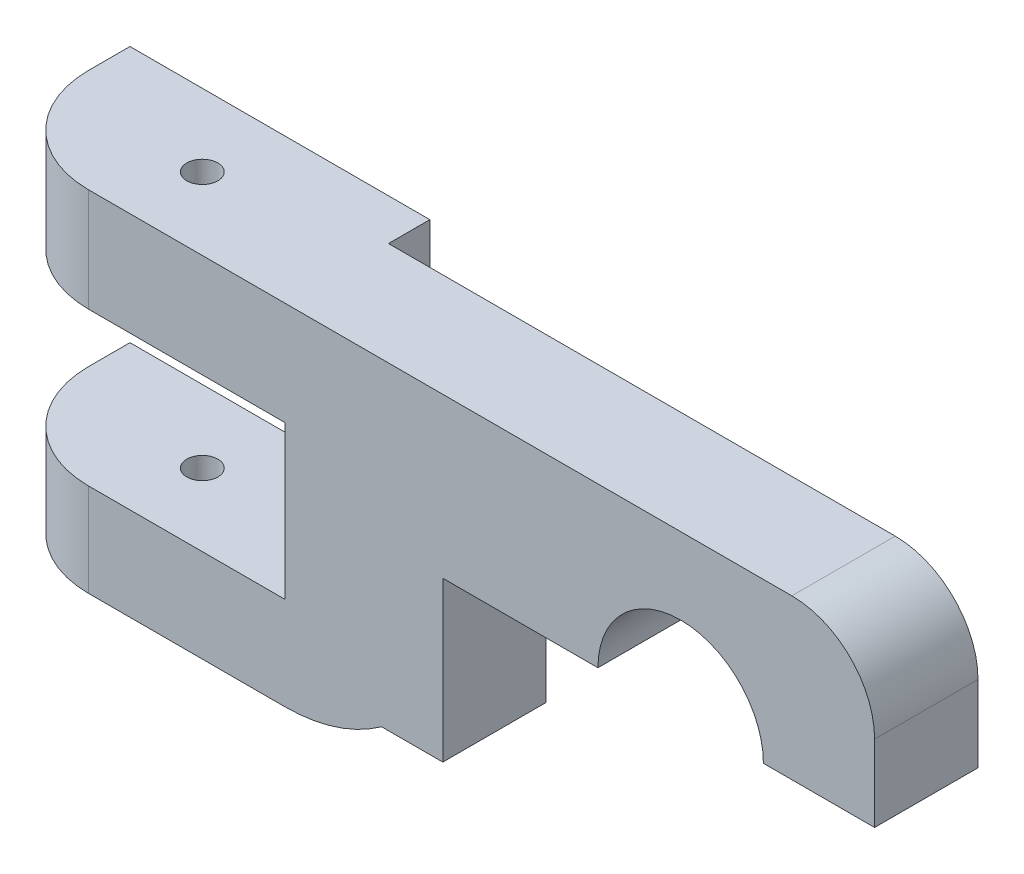
ISO-10303-21;
HEADER;
FILE_DESCRIPTION(('STEP AP214'),'2;1');
FILE_NAME('part.step','',(''),(''),'','','');
FILE_SCHEMA(('AUTOMOTIVE_DESIGN { 1 0 10303 214 1 1 1 1 }'));
ENDSEC;
DATA;
#1=APPLICATION_CONTEXT('core data for automotive mechanical design processes');
#2=APPLICATION_PROTOCOL_DEFINITION('international standard','automotive_design',2000,#1);
#3=PRODUCT_CONTEXT('',#1,'mechanical');
#4=PRODUCT('Part','Part','',(#3));
#5=PRODUCT_RELATED_PRODUCT_CATEGORY('part','',(#4));
#6=PRODUCT_DEFINITION_FORMATION('','',#4);
#7=PRODUCT_DEFINITION_CONTEXT('part definition',#1,'design');
#8=PRODUCT_DEFINITION('design','',#6,#7);
#9=PRODUCT_DEFINITION_SHAPE('','',#8);
#10=(LENGTH_UNIT() NAMED_UNIT(*) SI_UNIT(.MILLI.,.METRE.));
#11=(NAMED_UNIT(*) PLANE_ANGLE_UNIT() SI_UNIT($,.RADIAN.));
#12=(NAMED_UNIT(*) SI_UNIT($,.STERADIAN.) SOLID_ANGLE_UNIT());
#13=UNCERTAINTY_MEASURE_WITH_UNIT(LENGTH_MEASURE(1.E-05),#10,'distance_accuracy_value','');
#14=(GEOMETRIC_REPRESENTATION_CONTEXT(3) GLOBAL_UNCERTAINTY_ASSIGNED_CONTEXT((#13)) GLOBAL_UNIT_ASSIGNED_CONTEXT((#10,
#11,#12)) REPRESENTATION_CONTEXT('',''));
#15=CARTESIAN_POINT('',(0.,0.,0.));
#16=DIRECTION('',(0.,0.,1.));
#17=DIRECTION('',(1.,0.,0.));
#18=AXIS2_PLACEMENT_3D('',#15,#16,#17);
#19=CARTESIAN_POINT('',(0.,-33.8,96.5));
#20=DIRECTION('',(0.,1.,0.));
#21=DIRECTION('',(0.,0.,1.));
#22=AXIS2_PLACEMENT_3D('',#19,#20,#21);
#23=PLANE('',#22);
#24=CARTESIAN_POINT('',(14.,-33.8,89.5));
#25=DIRECTION('',(0.,1.,0.));
#26=DIRECTION('',(0.,0.,1.));
#27=AXIS2_PLACEMENT_3D('',#24,#25,#26);
#28=CIRCLE('',#27,1.5);
#29=CARTESIAN_POINT('',(14.,-33.8,91.));
#30=VERTEX_POINT('',#29);
#31=EDGE_CURVE('E230',#30,#30,#28,.T.);
#32=ORIENTED_EDGE('',*,*,#31,.T.);
#33=EDGE_LOOP('',(#32));
#34=FACE_BOUND('',#33,.T.);
#35=DIRECTION('',(0.,0.,-1.));
#36=VECTOR('',#35,1.);
#37=CARTESIAN_POINT('',(0.,-33.8,96.5));
#38=LINE('',#37,#36);
#39=CARTESIAN_POINT('',(0.,-33.8,86.5));
#40=VERTEX_POINT('',#39);
#41=CARTESIAN_POINT('',(0.,-33.8,82.5));
#42=VERTEX_POINT('',#41);
#43=EDGE_CURVE('E232',#40,#42,#38,.T.);
#44=ORIENTED_EDGE('',*,*,#43,.T.);
#45=DIRECTION('',(1.,0.,0.));
#46=VECTOR('',#45,1.);
#47=CARTESIAN_POINT('',(29.,-33.8,82.5));
#48=LINE('',#47,#46);
#49=CARTESIAN_POINT('',(29.,-33.8,82.5));
#50=VERTEX_POINT('',#49);
#51=EDGE_CURVE('E259',#42,#50,#48,.T.);
#52=ORIENTED_EDGE('',*,*,#51,.T.);
#53=DIRECTION('',(0.,0.,-1.));
#54=VECTOR('',#53,1.);
#55=CARTESIAN_POINT('',(29.,-33.8,96.5));
#56=LINE('',#55,#54);
#57=CARTESIAN_POINT('',(29.,-33.8,86.5));
#58=VERTEX_POINT('',#57);
#59=EDGE_CURVE('E261',#50,#58,#56,.F.);
#60=ORIENTED_EDGE('',*,*,#59,.T.);
#61=DIRECTION('',(0.,0.,-1.));
#62=VECTOR('',#61,1.);
#63=CARTESIAN_POINT('',(29.,-33.8,96.5));
#64=LINE('',#63,#62);
#65=CARTESIAN_POINT('',(29.,-33.8,96.5));
#66=VERTEX_POINT('',#65);
#67=EDGE_CURVE('E207',#66,#58,#64,.T.);
#68=ORIENTED_EDGE('',*,*,#67,.F.);
#69=DIRECTION('',(1.,0.,0.));
#70=VECTOR('',#69,1.);
#71=CARTESIAN_POINT('',(0.,-33.8,96.5));
#72=LINE('',#71,#70);
#73=CARTESIAN_POINT('',(10.,-33.8,96.5));
#74=VERTEX_POINT('',#73);
#75=EDGE_CURVE('E201',#74,#66,#72,.T.);
#76=ORIENTED_EDGE('',*,*,#75,.F.);
#77=CARTESIAN_POINT('',(10.,-33.8,86.5));
#78=DIRECTION('',(0.,1.,0.));
#79=DIRECTION('',(0.,0.,1.));
#80=AXIS2_PLACEMENT_3D('',#77,#78,#79);
#81=CIRCLE('',#80,10.);
#82=EDGE_CURVE('E291',#74,#40,#81,.F.);
#83=ORIENTED_EDGE('',*,*,#82,.T.);
#84=EDGE_LOOP('',(#44,#52,#60,#68,#76,#83));
#85=FACE_BOUND('',#84,.T.);
#86=ADVANCED_FACE('F36',(#34,#85),#23,.F.);
#87=CARTESIAN_POINT('',(0.,0.,96.5));
#88=DIRECTION('',(1.,0.,0.));
#89=DIRECTION('',(0.,1.,0.));
#90=AXIS2_PLACEMENT_3D('',#87,#88,#89);
#91=PLANE('',#90);
#92=DIRECTION('',(0.,0.,-1.));
#93=VECTOR('',#92,1.);
#94=CARTESIAN_POINT('',(0.,-24.8,96.5));
#95=LINE('',#94,#93);
#96=CARTESIAN_POINT('',(0.,-24.8,86.5));
#97=VERTEX_POINT('',#96);
#98=CARTESIAN_POINT('',(0.,-24.8,82.5));
#99=VERTEX_POINT('',#98);
#100=EDGE_CURVE('E287',#97,#99,#95,.T.);
#101=ORIENTED_EDGE('',*,*,#100,.T.);
#102=DIRECTION('',(0.,1.,0.));
#103=VECTOR('',#102,1.);
#104=CARTESIAN_POINT('',(0.,-33.8,82.5));
#105=LINE('',#104,#103);
#106=EDGE_CURVE('E11',#42,#99,#105,.T.);
#107=ORIENTED_EDGE('',*,*,#106,.F.);
#108=ORIENTED_EDGE('',*,*,#43,.F.);
#109=DIRECTION('',(0.,-1.,0.));
#110=VECTOR('',#109,1.);
#111=CARTESIAN_POINT('',(0.,-24.8,86.5));
#112=LINE('',#111,#110);
#113=EDGE_CURVE('E290',#40,#97,#112,.F.);
#114=ORIENTED_EDGE('',*,*,#113,.T.);
#115=EDGE_LOOP('',(#101,#107,#108,#114));
#116=FACE_BOUND('',#115,.T.);
#117=ADVANCED_FACE('F376',(#116),#91,.F.);
#118=CARTESIAN_POINT('',(0.,-24.8,96.5));
#119=DIRECTION('',(0.,1.,0.));
#120=DIRECTION('',(0.,0.,1.));
#121=AXIS2_PLACEMENT_3D('',#118,#119,#120);
#122=PLANE('',#121);
#123=DIRECTION('',(1.,0.,0.));
#124=VECTOR('',#123,1.);
#125=CARTESIAN_POINT('',(0.,-24.8,82.5));
#126=LINE('',#125,#124);
#127=CARTESIAN_POINT('',(29.,-24.8,82.5));
#128=VERTEX_POINT('',#127);
#129=EDGE_CURVE('E46',#99,#128,#126,.T.);
#130=ORIENTED_EDGE('',*,*,#129,.F.);
#131=ORIENTED_EDGE('',*,*,#100,.F.);
#132=CARTESIAN_POINT('',(10.,-24.8,86.5));
#133=DIRECTION('',(0.,1.,0.));
#134=DIRECTION('',(0.,0.,1.));
#135=AXIS2_PLACEMENT_3D('',#132,#133,#134);
#136=CIRCLE('',#135,10.);
#137=CARTESIAN_POINT('',(10.,-24.8,96.5));
#138=VERTEX_POINT('',#137);
#139=EDGE_CURVE('E327',#97,#138,#136,.T.);
#140=ORIENTED_EDGE('',*,*,#139,.T.);
#141=DIRECTION('',(1.,0.,0.));
#142=VECTOR('',#141,1.);
#143=CARTESIAN_POINT('',(0.,-24.8,96.5));
#144=LINE('',#143,#142);
#145=CARTESIAN_POINT('',(29.,-24.8,96.5));
#146=VERTEX_POINT('',#145);
#147=EDGE_CURVE('E286',#138,#146,#144,.T.);
#148=ORIENTED_EDGE('',*,*,#147,.T.);
#149=DIRECTION('',(0.,0.,-1.));
#150=VECTOR('',#149,1.);
#151=CARTESIAN_POINT('',(29.,-24.8,96.5));
#152=LINE('',#151,#150);
#153=CARTESIAN_POINT('',(29.,-24.8,86.5));
#154=VERTEX_POINT('',#153);
#155=EDGE_CURVE('E282',#146,#154,#152,.T.);
#156=ORIENTED_EDGE('',*,*,#155,.T.);
#157=DIRECTION('',(0.,0.,1.));
#158=VECTOR('',#157,1.);
#159=CARTESIAN_POINT('',(29.,-24.8,96.5));
#160=LINE('',#159,#158);
#161=EDGE_CURVE('E255',#128,#154,#160,.T.);
#162=ORIENTED_EDGE('',*,*,#161,.F.);
#163=EDGE_LOOP('',(#130,#131,#140,#148,#156,#162));
#164=FACE_BOUND('',#163,.T.);
#165=CARTESIAN_POINT('',(14.,-24.8,89.5));
#166=DIRECTION('',(0.,1.,0.));
#167=DIRECTION('',(0.,0.,1.));
#168=AXIS2_PLACEMENT_3D('',#165,#166,#167);
#169=CIRCLE('',#168,1.5);
#170=CARTESIAN_POINT('',(14.,-24.8,91.));
#171=VERTEX_POINT('',#170);
#172=EDGE_CURVE('E221',#171,#171,#169,.T.);
#173=ORIENTED_EDGE('',*,*,#172,.F.);
#174=EDGE_LOOP('',(#173));
#175=FACE_BOUND('',#174,.T.);
#176=ADVANCED_FACE('F382',(#164,#175),#122,.T.);
#177=CARTESIAN_POINT('',(29.,-10.,96.5));
#178=DIRECTION('',(0.,-1.,0.));
#179=DIRECTION('',(1.,0.,0.));
#180=AXIS2_PLACEMENT_3D('',#177,#178,#179);
#181=PLANE('',#180);
#182=DIRECTION('',(-1.,0.,0.));
#183=VECTOR('',#182,1.);
#184=CARTESIAN_POINT('',(29.,-10.,82.5));
#185=LINE('',#184,#183);
#186=CARTESIAN_POINT('',(29.,-9.99999999999999,82.5));
#187=VERTEX_POINT('',#186);
#188=CARTESIAN_POINT('',(0.,-10.,82.5));
#189=VERTEX_POINT('',#188);
#190=EDGE_CURVE('E243',#187,#189,#185,.T.);
#191=ORIENTED_EDGE('',*,*,#190,.F.);
#192=DIRECTION('',(0.,0.,-1.));
#193=VECTOR('',#192,1.);
#194=CARTESIAN_POINT('',(29.,-10.,96.5));
#195=LINE('',#194,#193);
#196=CARTESIAN_POINT('',(29.,-10.,86.5));
#197=VERTEX_POINT('',#196);
#198=EDGE_CURVE('E293',#197,#187,#195,.T.);
#199=ORIENTED_EDGE('',*,*,#198,.F.);
#200=DIRECTION('',(0.,0.,-1.));
#201=VECTOR('',#200,1.);
#202=CARTESIAN_POINT('',(29.,-10.,96.5));
#203=LINE('',#202,#201);
#204=CARTESIAN_POINT('',(29.,-10.,96.5));
#205=VERTEX_POINT('',#204);
#206=EDGE_CURVE('E217',#205,#197,#203,.T.);
#207=ORIENTED_EDGE('',*,*,#206,.F.);
#208=DIRECTION('',(-1.,0.,0.));
#209=VECTOR('',#208,1.);
#210=CARTESIAN_POINT('',(29.,-10.,96.5));
#211=LINE('',#210,#209);
#212=CARTESIAN_POINT('',(10.,-10.,96.5));
#213=VERTEX_POINT('',#212);
#214=EDGE_CURVE('E285',#205,#213,#211,.T.);
#215=ORIENTED_EDGE('',*,*,#214,.T.);
#216=CARTESIAN_POINT('',(10.,-10.,86.5));
#217=DIRECTION('',(0.,-1.,0.));
#218=DIRECTION('',(1.,0.,0.));
#219=AXIS2_PLACEMENT_3D('',#216,#217,#218);
#220=CIRCLE('',#219,10.);
#221=CARTESIAN_POINT('',(0.,-10.,86.5));
#222=VERTEX_POINT('',#221);
#223=EDGE_CURVE('E278',#213,#222,#220,.T.);
#224=ORIENTED_EDGE('',*,*,#223,.T.);
#225=DIRECTION('',(0.,0.,-1.));
#226=VECTOR('',#225,1.);
#227=CARTESIAN_POINT('',(0.,-10.,96.5));
#228=LINE('',#227,#226);
#229=EDGE_CURVE('E275',#222,#189,#228,.T.);
#230=ORIENTED_EDGE('',*,*,#229,.T.);
#231=EDGE_LOOP('',(#191,#199,#207,#215,#224,#230));
#232=FACE_BOUND('',#231,.T.);
#233=CARTESIAN_POINT('',(14.,-10.,89.5));
#234=DIRECTION('',(0.,-1.,0.));
#235=DIRECTION('',(1.,0.,0.));
#236=AXIS2_PLACEMENT_3D('',#233,#234,#235);
#237=CIRCLE('',#236,1.5);
#238=CARTESIAN_POINT('',(15.5,-10.,89.5));
#239=VERTEX_POINT('',#238);
#240=EDGE_CURVE('E225',#239,#239,#237,.T.);
#241=ORIENTED_EDGE('',*,*,#240,.F.);
#242=EDGE_LOOP('',(#241));
#243=FACE_BOUND('',#242,.T.);
#244=ADVANCED_FACE('F38',(#232,#243),#181,.T.);
#245=CARTESIAN_POINT('',(0.,-10.,96.5));
#246=DIRECTION('',(-1.,0.,0.));
#247=DIRECTION('',(0.,0.,1.));
#248=AXIS2_PLACEMENT_3D('',#245,#246,#247);
#249=PLANE('',#248);
#250=CARTESIAN_POINT('',(0.,0.,82.5));
#251=VERTEX_POINT('',#250);
#252=EDGE_CURVE('E48',#189,#251,#105,.T.);
#253=ORIENTED_EDGE('',*,*,#252,.F.);
#254=ORIENTED_EDGE('',*,*,#229,.F.);
#255=DIRECTION('',(0.,1.,0.));
#256=VECTOR('',#255,1.);
#257=CARTESIAN_POINT('',(0.,-10.,86.5));
#258=LINE('',#257,#256);
#259=CARTESIAN_POINT('',(0.,0.,86.5));
#260=VERTEX_POINT('',#259);
#261=EDGE_CURVE('E274',#222,#260,#258,.T.);
#262=ORIENTED_EDGE('',*,*,#261,.T.);
#263=DIRECTION('',(0.,0.,-1.));
#264=VECTOR('',#263,1.);
#265=CARTESIAN_POINT('',(0.,0.,96.5));
#266=LINE('',#265,#264);
#267=EDGE_CURVE('E270',#260,#251,#266,.T.);
#268=ORIENTED_EDGE('',*,*,#267,.T.);
#269=EDGE_LOOP('',(#253,#254,#262,#268));
#270=FACE_BOUND('',#269,.T.);
#271=ADVANCED_FACE('F390',(#270),#249,.T.);
#272=CARTESIAN_POINT('',(0.,0.,96.5));
#273=DIRECTION('',(0.,1.,0.));
#274=DIRECTION('',(0.,0.,1.));
#275=AXIS2_PLACEMENT_3D('',#272,#273,#274);
#276=PLANE('',#275);
#277=DIRECTION('',(1.,0.,0.));
#278=VECTOR('',#277,1.);
#279=CARTESIAN_POINT('',(29.,0.,82.5));
#280=LINE('',#279,#278);
#281=CARTESIAN_POINT('',(29.,0.,82.5));
#282=VERTEX_POINT('',#281);
#283=EDGE_CURVE('E251',#251,#282,#280,.T.);
#284=ORIENTED_EDGE('',*,*,#283,.F.);
#285=ORIENTED_EDGE('',*,*,#267,.F.);
#286=CARTESIAN_POINT('',(10.,0.,86.5));
#287=DIRECTION('',(0.,1.,0.));
#288=DIRECTION('',(0.,0.,1.));
#289=AXIS2_PLACEMENT_3D('',#286,#287,#288);
#290=CIRCLE('',#289,10.);
#291=CARTESIAN_POINT('',(10.,0.,96.5));
#292=VERTEX_POINT('',#291);
#293=EDGE_CURVE('E273',#260,#292,#290,.T.);
#294=ORIENTED_EDGE('',*,*,#293,.T.);
#295=DIRECTION('',(1.,0.,0.));
#296=VECTOR('',#295,1.);
#297=CARTESIAN_POINT('',(0.,0.,96.5));
#298=LINE('',#297,#296);
#299=CARTESIAN_POINT('',(78.,0.,96.5));
#300=VERTEX_POINT('',#299);
#301=EDGE_CURVE('E312',#292,#300,#298,.T.);
#302=ORIENTED_EDGE('',*,*,#301,.T.);
#303=DIRECTION('',(0.,0.,-1.));
#304=VECTOR('',#303,1.);
#305=CARTESIAN_POINT('',(78.,0.,96.5));
#306=LINE('',#305,#304);
#307=CARTESIAN_POINT('',(78.,0.,86.5));
#308=VERTEX_POINT('',#307);
#309=EDGE_CURVE('E256',#300,#308,#306,.T.);
#310=ORIENTED_EDGE('',*,*,#309,.T.);
#311=DIRECTION('',(1.,0.,0.));
#312=VECTOR('',#311,1.);
#313=CARTESIAN_POINT('',(86.,0.,86.5));
#314=LINE('',#313,#312);
#315=CARTESIAN_POINT('',(29.,0.,86.5));
#316=VERTEX_POINT('',#315);
#317=EDGE_CURVE('E211',#316,#308,#314,.T.);
#318=ORIENTED_EDGE('',*,*,#317,.F.);
#319=DIRECTION('',(0.,0.,1.));
#320=VECTOR('',#319,1.);
#321=CARTESIAN_POINT('',(29.,0.,10.));
#322=LINE('',#321,#320);
#323=EDGE_CURVE('E40',#282,#316,#322,.T.);
#324=ORIENTED_EDGE('',*,*,#323,.F.);
#325=EDGE_LOOP('',(#284,#285,#294,#302,#310,#318,#324));
#326=FACE_BOUND('',#325,.T.);
#327=CARTESIAN_POINT('',(14.,0.,89.5));
#328=DIRECTION('',(0.,1.,0.));
#329=DIRECTION('',(0.,0.,1.));
#330=AXIS2_PLACEMENT_3D('',#327,#328,#329);
#331=CIRCLE('',#330,1.5);
#332=CARTESIAN_POINT('',(14.,0.,91.));
#333=VERTEX_POINT('',#332);
#334=EDGE_CURVE('E224',#333,#333,#331,.T.);
#335=ORIENTED_EDGE('',*,*,#334,.F.);
#336=EDGE_LOOP('',(#335));
#337=FACE_BOUND('',#336,.T.);
#338=ADVANCED_FACE('F308',(#326,#337),#276,.T.);
#339=CARTESIAN_POINT('',(29.,-102.,10.));
#340=DIRECTION('',(-1.,0.,0.));
#341=DIRECTION('',(0.,0.,1.));
#342=AXIS2_PLACEMENT_3D('',#339,#340,#341);
#343=PLANE('',#342);
#344=ORIENTED_EDGE('',*,*,#59,.F.);
#345=DIRECTION('',(0.,1.,0.));
#346=VECTOR('',#345,1.);
#347=CARTESIAN_POINT('',(29.,-33.8,82.5));
#348=LINE('',#347,#346);
#349=EDGE_CURVE('E69',#50,#128,#348,.T.);
#350=ORIENTED_EDGE('',*,*,#349,.T.);
#351=ORIENTED_EDGE('',*,*,#161,.T.);
#352=DIRECTION('',(0.,1.,0.));
#353=VECTOR('',#352,1.);
#354=CARTESIAN_POINT('',(29.,-102.,86.5));
#355=LINE('',#354,#353);
#356=EDGE_CURVE('E213',#58,#154,#355,.T.);
#357=ORIENTED_EDGE('',*,*,#356,.F.);
#358=EDGE_LOOP('',(#344,#350,#351,#357));
#359=FACE_BOUND('',#358,.T.);
#360=ADVANCED_FACE('F389',(#359),#343,.F.);
#361=ORIENTED_EDGE('',*,*,#198,.T.);
#362=EDGE_CURVE('E257',#187,#282,#348,.T.);
#363=ORIENTED_EDGE('',*,*,#362,.T.);
#364=ORIENTED_EDGE('',*,*,#323,.T.);
#365=EDGE_CURVE('E208',#197,#316,#355,.T.);
#366=ORIENTED_EDGE('',*,*,#365,.F.);
#367=EDGE_LOOP('',(#361,#363,#364,#366));
#368=FACE_BOUND('',#367,.T.);
#369=ADVANCED_FACE('F300',(#368),#343,.F.);
#370=CARTESIAN_POINT('',(29.,-17.8,96.5));
#371=DIRECTION('',(0.,0.,-1.));
#372=DIRECTION('',(-1.,0.,0.));
#373=AXIS2_PLACEMENT_3D('',#370,#371,#372);
#374=CYLINDRICAL_SURFACE('',#373,16.);
#375=ORIENTED_EDGE('',*,*,#67,.T.);
#376=CARTESIAN_POINT('',(29.,-17.8,86.5));
#377=DIRECTION('',(0.,0.,1.));
#378=DIRECTION('',(1.,0.,0.));
#379=AXIS2_PLACEMENT_3D('',#376,#377,#378);
#380=CIRCLE('',#379,16.);
#381=CARTESIAN_POINT('',(38.3273790530888,-30.8,86.5));
#382=VERTEX_POINT('',#381);
#383=EDGE_CURVE('E203',#58,#382,#380,.T.);
#384=ORIENTED_EDGE('',*,*,#383,.T.);
#385=DIRECTION('',(0.,0.,-1.));
#386=VECTOR('',#385,1.);
#387=CARTESIAN_POINT('',(38.3273790530888,-30.8,96.5));
#388=LINE('',#387,#386);
#389=CARTESIAN_POINT('',(38.3273790530888,-30.8,96.5));
#390=VERTEX_POINT('',#389);
#391=EDGE_CURVE('E264',#390,#382,#388,.T.);
#392=ORIENTED_EDGE('',*,*,#391,.F.);
#393=CARTESIAN_POINT('',(29.,-17.8,96.5));
#394=DIRECTION('',(0.,0.,1.));
#395=DIRECTION('',(1.,0.,0.));
#396=AXIS2_PLACEMENT_3D('',#393,#394,#395);
#397=CIRCLE('',#396,16.);
#398=EDGE_CURVE('E331',#66,#390,#397,.T.);
#399=ORIENTED_EDGE('',*,*,#398,.F.);
#400=EDGE_LOOP('',(#375,#384,#392,#399));
#401=FACE_BOUND('',#400,.T.);
#402=ADVANCED_FACE('F421',(#401),#374,.T.);
#403=CARTESIAN_POINT('',(67.25,-15.4,96.5));
#404=DIRECTION('',(0.,0.,-1.));
#405=DIRECTION('',(-1.,0.,0.));
#406=AXIS2_PLACEMENT_3D('',#403,#404,#405);
#407=CYLINDRICAL_SURFACE('',#406,8.00000000000001);
#408=DIRECTION('',(0.,0.,1.));
#409=VECTOR('',#408,1.);
#410=CARTESIAN_POINT('',(75.25,-15.4,86.5));
#411=LINE('',#410,#409);
#412=CARTESIAN_POINT('',(75.25,-15.4,86.5));
#413=VERTEX_POINT('',#412);
#414=CARTESIAN_POINT('',(75.25,-15.4,96.5));
#415=VERTEX_POINT('',#414);
#416=EDGE_CURVE('E206',#413,#415,#411,.T.);
#417=ORIENTED_EDGE('',*,*,#416,.T.);
#418=CARTESIAN_POINT('',(67.25,-15.4,96.5));
#419=DIRECTION('',(0.,0.,1.));
#420=DIRECTION('',(1.,0.,0.));
#421=AXIS2_PLACEMENT_3D('',#418,#419,#420);
#422=CIRCLE('',#421,8.00000000000001);
#423=CARTESIAN_POINT('',(59.25,-15.4,96.5));
#424=VERTEX_POINT('',#423);
#425=EDGE_CURVE('E188',#415,#424,#422,.T.);
#426=ORIENTED_EDGE('',*,*,#425,.T.);
#427=DIRECTION('',(0.,0.,1.));
#428=VECTOR('',#427,1.);
#429=CARTESIAN_POINT('',(59.25,-15.4,86.5));
#430=LINE('',#429,#428);
#431=CARTESIAN_POINT('',(59.25,-15.4,86.5));
#432=VERTEX_POINT('',#431);
#433=EDGE_CURVE('E173',#432,#424,#430,.T.);
#434=ORIENTED_EDGE('',*,*,#433,.F.);
#435=CARTESIAN_POINT('',(67.25,-15.4,86.5));
#436=DIRECTION('',(0.,0.,1.));
#437=DIRECTION('',(1.,0.,0.));
#438=AXIS2_PLACEMENT_3D('',#435,#436,#437);
#439=CIRCLE('',#438,8.00000000000001);
#440=EDGE_CURVE('E180',#413,#432,#439,.T.);
#441=ORIENTED_EDGE('',*,*,#440,.F.);
#442=EDGE_LOOP('',(#417,#426,#434,#441));
#443=FACE_BOUND('',#442,.T.);
#444=ADVANCED_FACE('F186',(#443),#407,.F.);
#445=CARTESIAN_POINT('',(29.,-24.8,96.5));
#446=DIRECTION('',(-1.,0.,0.));
#447=DIRECTION('',(0.,-1.,0.));
#448=AXIS2_PLACEMENT_3D('',#445,#446,#447);
#449=PLANE('',#448);
#450=EDGE_CURVE('E212',#154,#197,#355,.T.);
#451=ORIENTED_EDGE('',*,*,#450,.F.);
#452=ORIENTED_EDGE('',*,*,#155,.F.);
#453=DIRECTION('',(0.,1.,0.));
#454=VECTOR('',#453,1.);
#455=CARTESIAN_POINT('',(29.,-24.8,96.5));
#456=LINE('',#455,#454);
#457=EDGE_CURVE('E281',#146,#205,#456,.T.);
#458=ORIENTED_EDGE('',*,*,#457,.T.);
#459=ORIENTED_EDGE('',*,*,#206,.T.);
#460=EDGE_LOOP('',(#451,#452,#458,#459));
#461=FACE_BOUND('',#460,.T.);
#462=ADVANCED_FACE('F420',(#461),#449,.T.);
#463=CARTESIAN_POINT('',(86.,0.,96.5));
#464=DIRECTION('',(1.,0.,0.));
#465=DIRECTION('',(0.,0.,-1.));
#466=AXIS2_PLACEMENT_3D('',#463,#464,#465);
#467=PLANE('',#466);
#468=DIRECTION('',(0.,0.,1.));
#469=VECTOR('',#468,1.);
#470=CARTESIAN_POINT('',(86.,-15.4,86.5));
#471=LINE('',#470,#469);
#472=CARTESIAN_POINT('',(86.,-15.4,86.5));
#473=VERTEX_POINT('',#472);
#474=CARTESIAN_POINT('',(86.,-15.4,96.5));
#475=VERTEX_POINT('',#474);
#476=EDGE_CURVE('E241',#473,#475,#471,.T.);
#477=ORIENTED_EDGE('',*,*,#476,.F.);
#478=DIRECTION('',(0.,1.,0.));
#479=VECTOR('',#478,1.);
#480=CARTESIAN_POINT('',(86.,-102.,86.5));
#481=LINE('',#480,#479);
#482=CARTESIAN_POINT('',(86.,-7.99999999999999,86.5));
#483=VERTEX_POINT('',#482);
#484=EDGE_CURVE('E214',#473,#483,#481,.T.);
#485=ORIENTED_EDGE('',*,*,#484,.T.);
#486=DIRECTION('',(0.,0.,-1.));
#487=VECTOR('',#486,1.);
#488=CARTESIAN_POINT('',(86.,-8.,96.5));
#489=LINE('',#488,#487);
#490=CARTESIAN_POINT('',(86.,-8.,96.5));
#491=VERTEX_POINT('',#490);
#492=EDGE_CURVE('E216',#483,#491,#489,.F.);
#493=ORIENTED_EDGE('',*,*,#492,.T.);
#494=DIRECTION('',(0.,-1.,0.));
#495=VECTOR('',#494,1.);
#496=CARTESIAN_POINT('',(86.,0.,96.5));
#497=LINE('',#496,#495);
#498=EDGE_CURVE('E240',#491,#475,#497,.T.);
#499=ORIENTED_EDGE('',*,*,#498,.T.);
#500=EDGE_LOOP('',(#477,#485,#493,#499));
#501=FACE_BOUND('',#500,.T.);
#502=ADVANCED_FACE('F356',(#501),#467,.T.);
#503=CARTESIAN_POINT('',(86.,-30.8,96.5));
#504=DIRECTION('',(0.,-1.,0.));
#505=DIRECTION('',(1.,0.,0.));
#506=AXIS2_PLACEMENT_3D('',#503,#504,#505);
#507=PLANE('',#506);
#508=DIRECTION('',(0.,0.,1.));
#509=VECTOR('',#508,1.);
#510=CARTESIAN_POINT('',(44.25,-30.8,86.5));
#511=LINE('',#510,#509);
#512=CARTESIAN_POINT('',(44.25,-30.8,86.5));
#513=VERTEX_POINT('',#512);
#514=CARTESIAN_POINT('',(44.25,-30.8,96.5));
#515=VERTEX_POINT('',#514);
#516=EDGE_CURVE('E236',#513,#515,#511,.T.);
#517=ORIENTED_EDGE('',*,*,#516,.T.);
#518=DIRECTION('',(-1.,0.,0.));
#519=VECTOR('',#518,1.);
#520=CARTESIAN_POINT('',(86.,-30.8,96.5));
#521=LINE('',#520,#519);
#522=EDGE_CURVE('E239',#515,#390,#521,.T.);
#523=ORIENTED_EDGE('',*,*,#522,.T.);
#524=ORIENTED_EDGE('',*,*,#391,.T.);
#525=DIRECTION('',(-1.,0.,0.));
#526=VECTOR('',#525,1.);
#527=CARTESIAN_POINT('',(86.,-30.8,86.5));
#528=LINE('',#527,#526);
#529=EDGE_CURVE('E248',#513,#382,#528,.T.);
#530=ORIENTED_EDGE('',*,*,#529,.F.);
#531=EDGE_LOOP('',(#517,#523,#524,#530));
#532=FACE_BOUND('',#531,.T.);
#533=ADVANCED_FACE('F419',(#532),#507,.T.);
#534=CARTESIAN_POINT('',(0.,0.,96.5));
#535=DIRECTION('',(0.,0.,1.));
#536=DIRECTION('',(1.,0.,0.));
#537=AXIS2_PLACEMENT_3D('',#534,#535,#536);
#538=PLANE('',#537);
#539=ORIENTED_EDGE('',*,*,#301,.F.);
#540=DIRECTION('',(0.,1.,0.));
#541=VECTOR('',#540,1.);
#542=CARTESIAN_POINT('',(10.,0.,96.5));
#543=LINE('',#542,#541);
#544=EDGE_CURVE('E267',#292,#213,#543,.F.);
#545=ORIENTED_EDGE('',*,*,#544,.T.);
#546=ORIENTED_EDGE('',*,*,#214,.F.);
#547=ORIENTED_EDGE('',*,*,#457,.F.);
#548=ORIENTED_EDGE('',*,*,#147,.F.);
#549=DIRECTION('',(0.,-1.,0.));
#550=VECTOR('',#549,1.);
#551=CARTESIAN_POINT('',(10.,-33.8,96.5));
#552=LINE('',#551,#550);
#553=EDGE_CURVE('E337',#138,#74,#552,.T.);
#554=ORIENTED_EDGE('',*,*,#553,.T.);
#555=ORIENTED_EDGE('',*,*,#75,.T.);
#556=ORIENTED_EDGE('',*,*,#398,.T.);
#557=ORIENTED_EDGE('',*,*,#522,.F.);
#558=DIRECTION('',(0.,-1.,0.));
#559=VECTOR('',#558,1.);
#560=CARTESIAN_POINT('',(44.25,-15.4,96.5));
#561=LINE('',#560,#559);
#562=CARTESIAN_POINT('',(44.25,-15.4,96.5));
#563=VERTEX_POINT('',#562);
#564=EDGE_CURVE('E189',#563,#515,#561,.T.);
#565=ORIENTED_EDGE('',*,*,#564,.F.);
#566=DIRECTION('',(-1.,0.,0.));
#567=VECTOR('',#566,1.);
#568=CARTESIAN_POINT('',(59.25,-15.4,96.5));
#569=LINE('',#568,#567);
#570=EDGE_CURVE('E190',#424,#563,#569,.T.);
#571=ORIENTED_EDGE('',*,*,#570,.F.);
#572=ORIENTED_EDGE('',*,*,#425,.F.);
#573=DIRECTION('',(-1.,0.,0.));
#574=VECTOR('',#573,1.);
#575=CARTESIAN_POINT('',(75.25,-15.4,96.5));
#576=LINE('',#575,#574);
#577=EDGE_CURVE('E235',#475,#415,#576,.T.);
#578=ORIENTED_EDGE('',*,*,#577,.F.);
#579=ORIENTED_EDGE('',*,*,#498,.F.);
#580=CARTESIAN_POINT('',(78.,-8.,96.5));
#581=DIRECTION('',(0.,0.,1.));
#582=DIRECTION('',(1.,0.,0.));
#583=AXIS2_PLACEMENT_3D('',#580,#581,#582);
#584=CIRCLE('',#583,8.);
#585=EDGE_CURVE('E197',#491,#300,#584,.T.);
#586=ORIENTED_EDGE('',*,*,#585,.T.);
#587=EDGE_LOOP('',(#539,#545,#546,#547,#548,#554,#555,#556,#557,#565,#571,#572,#578,#579,#586));
#588=FACE_BOUND('',#587,.T.);
#589=ADVANCED_FACE('F358',(#588),#538,.T.);
#590=CARTESIAN_POINT('',(86.,-102.,86.5));
#591=DIRECTION('',(0.,0.,1.));
#592=DIRECTION('',(1.,0.,0.));
#593=AXIS2_PLACEMENT_3D('',#590,#591,#592);
#594=PLANE('',#593);
#595=ORIENTED_EDGE('',*,*,#484,.F.);
#596=DIRECTION('',(-1.,0.,0.));
#597=VECTOR('',#596,1.);
#598=CARTESIAN_POINT('',(75.25,-15.4,86.5));
#599=LINE('',#598,#597);
#600=EDGE_CURVE('E195',#473,#413,#599,.T.);
#601=ORIENTED_EDGE('',*,*,#600,.T.);
#602=ORIENTED_EDGE('',*,*,#440,.T.);
#603=DIRECTION('',(-1.,0.,0.));
#604=VECTOR('',#603,1.);
#605=CARTESIAN_POINT('',(59.25,-15.4,86.5));
#606=LINE('',#605,#604);
#607=CARTESIAN_POINT('',(44.25,-15.4,86.5));
#608=VERTEX_POINT('',#607);
#609=EDGE_CURVE('E169',#432,#608,#606,.T.);
#610=ORIENTED_EDGE('',*,*,#609,.T.);
#611=DIRECTION('',(0.,-1.,0.));
#612=VECTOR('',#611,1.);
#613=CARTESIAN_POINT('',(44.25,-15.4,86.5));
#614=LINE('',#613,#612);
#615=EDGE_CURVE('E179',#608,#513,#614,.T.);
#616=ORIENTED_EDGE('',*,*,#615,.T.);
#617=ORIENTED_EDGE('',*,*,#529,.T.);
#618=ORIENTED_EDGE('',*,*,#383,.F.);
#619=ORIENTED_EDGE('',*,*,#356,.T.);
#620=ORIENTED_EDGE('',*,*,#450,.T.);
#621=ORIENTED_EDGE('',*,*,#365,.T.);
#622=ORIENTED_EDGE('',*,*,#317,.T.);
#623=CARTESIAN_POINT('',(78.,-8.,86.5));
#624=DIRECTION('',(0.,0.,1.));
#625=DIRECTION('',(1.,0.,0.));
#626=AXIS2_PLACEMENT_3D('',#623,#624,#625);
#627=CIRCLE('',#626,8.);
#628=EDGE_CURVE('E220',#308,#483,#627,.F.);
#629=ORIENTED_EDGE('',*,*,#628,.T.);
#630=EDGE_LOOP('',(#595,#601,#602,#610,#616,#617,#618,#619,#620,#621,#622,#629));
#631=FACE_BOUND('',#630,.T.);
#632=ADVANCED_FACE('F194',(#631),#594,.F.);
#633=CARTESIAN_POINT('',(78.,-8.,96.5));
#634=DIRECTION('',(0.,0.,-1.));
#635=DIRECTION('',(-1.,0.,0.));
#636=AXIS2_PLACEMENT_3D('',#633,#634,#635);
#637=CYLINDRICAL_SURFACE('',#636,8.);
#638=ORIENTED_EDGE('',*,*,#585,.F.);
#639=ORIENTED_EDGE('',*,*,#492,.F.);
#640=ORIENTED_EDGE('',*,*,#628,.F.);
#641=ORIENTED_EDGE('',*,*,#309,.F.);
#642=EDGE_LOOP('',(#638,#639,#640,#641));
#643=FACE_BOUND('',#642,.T.);
#644=ADVANCED_FACE('F352',(#643),#637,.T.);
#645=CARTESIAN_POINT('',(14.,-33.8,89.5));
#646=DIRECTION('',(0.,1.,0.));
#647=DIRECTION('',(0.,0.,1.));
#648=AXIS2_PLACEMENT_3D('',#645,#646,#647);
#649=CYLINDRICAL_SURFACE('',#648,1.5);
#650=ORIENTED_EDGE('',*,*,#240,.T.);
#651=EDGE_LOOP('',(#650));
#652=FACE_BOUND('',#651,.T.);
#653=ORIENTED_EDGE('',*,*,#334,.T.);
#654=EDGE_LOOP('',(#653));
#655=FACE_BOUND('',#654,.T.);
#656=ADVANCED_FACE('F445',(#652,#655),#649,.F.);
#657=ORIENTED_EDGE('',*,*,#172,.T.);
#658=EDGE_LOOP('',(#657));
#659=FACE_BOUND('',#658,.T.);
#660=ORIENTED_EDGE('',*,*,#31,.F.);
#661=EDGE_LOOP('',(#660));
#662=FACE_BOUND('',#661,.T.);
#663=ADVANCED_FACE('F442',(#659,#662),#649,.F.);
#664=CARTESIAN_POINT('',(59.25,-15.4,86.5));
#665=DIRECTION('',(0.,1.,0.));
#666=DIRECTION('',(-1.,0.,0.));
#667=AXIS2_PLACEMENT_3D('',#664,#665,#666);
#668=PLANE('',#667);
#669=ORIENTED_EDGE('',*,*,#570,.T.);
#670=DIRECTION('',(0.,0.,1.));
#671=VECTOR('',#670,1.);
#672=CARTESIAN_POINT('',(44.25,-15.4,86.5));
#673=LINE('',#672,#671);
#674=EDGE_CURVE('E175',#608,#563,#673,.T.);
#675=ORIENTED_EDGE('',*,*,#674,.F.);
#676=ORIENTED_EDGE('',*,*,#609,.F.);
#677=ORIENTED_EDGE('',*,*,#433,.T.);
#678=EDGE_LOOP('',(#669,#675,#676,#677));
#679=FACE_BOUND('',#678,.T.);
#680=ADVANCED_FACE('F172',(#679),#668,.F.);
#681=CARTESIAN_POINT('',(44.25,-15.4,86.5));
#682=DIRECTION('',(-1.,0.,0.));
#683=DIRECTION('',(0.,0.,1.));
#684=AXIS2_PLACEMENT_3D('',#681,#682,#683);
#685=PLANE('',#684);
#686=ORIENTED_EDGE('',*,*,#564,.T.);
#687=ORIENTED_EDGE('',*,*,#516,.F.);
#688=ORIENTED_EDGE('',*,*,#615,.F.);
#689=ORIENTED_EDGE('',*,*,#674,.T.);
#690=EDGE_LOOP('',(#686,#687,#688,#689));
#691=FACE_BOUND('',#690,.T.);
#692=ADVANCED_FACE('F363',(#691),#685,.F.);
#693=CARTESIAN_POINT('',(75.25,-15.4,86.5));
#694=DIRECTION('',(0.,1.,0.));
#695=DIRECTION('',(0.,0.,1.));
#696=AXIS2_PLACEMENT_3D('',#693,#694,#695);
#697=PLANE('',#696);
#698=ORIENTED_EDGE('',*,*,#577,.T.);
#699=ORIENTED_EDGE('',*,*,#416,.F.);
#700=ORIENTED_EDGE('',*,*,#600,.F.);
#701=ORIENTED_EDGE('',*,*,#476,.T.);
#702=EDGE_LOOP('',(#698,#699,#700,#701));
#703=FACE_BOUND('',#702,.T.);
#704=ADVANCED_FACE('F360',(#703),#697,.F.);
#705=CARTESIAN_POINT('',(10.,-10.,86.5));
#706=DIRECTION('',(0.,1.,0.));
#707=DIRECTION('',(0.,0.,1.));
#708=AXIS2_PLACEMENT_3D('',#705,#706,#707);
#709=CYLINDRICAL_SURFACE('',#708,10.);
#710=ORIENTED_EDGE('',*,*,#223,.F.);
#711=ORIENTED_EDGE('',*,*,#544,.F.);
#712=ORIENTED_EDGE('',*,*,#293,.F.);
#713=ORIENTED_EDGE('',*,*,#261,.F.);
#714=EDGE_LOOP('',(#710,#711,#712,#713));
#715=FACE_BOUND('',#714,.T.);
#716=ADVANCED_FACE('F362',(#715),#709,.T.);
#717=CARTESIAN_POINT('',(10.,0.,86.5));
#718=DIRECTION('',(0.,1.,0.));
#719=DIRECTION('',(-1.,0.,0.));
#720=AXIS2_PLACEMENT_3D('',#717,#718,#719);
#721=CYLINDRICAL_SURFACE('',#720,10.);
#722=ORIENTED_EDGE('',*,*,#139,.F.);
#723=ORIENTED_EDGE('',*,*,#113,.F.);
#724=ORIENTED_EDGE('',*,*,#82,.F.);
#725=ORIENTED_EDGE('',*,*,#553,.F.);
#726=EDGE_LOOP('',(#722,#723,#724,#725));
#727=FACE_BOUND('',#726,.T.);
#728=ADVANCED_FACE('F369',(#727),#721,.T.);
#729=CARTESIAN_POINT('',(29.,-33.8,82.5));
#730=DIRECTION('',(0.,0.,1.));
#731=DIRECTION('',(1.,0.,0.));
#732=AXIS2_PLACEMENT_3D('',#729,#730,#731);
#733=PLANE('',#732);
#734=ORIENTED_EDGE('',*,*,#190,.T.);
#735=ORIENTED_EDGE('',*,*,#252,.T.);
#736=ORIENTED_EDGE('',*,*,#283,.T.);
#737=ORIENTED_EDGE('',*,*,#362,.F.);
#738=EDGE_LOOP('',(#734,#735,#736,#737));
#739=FACE_BOUND('',#738,.T.);
#740=ADVANCED_FACE('F407',(#739),#733,.F.);
#741=ORIENTED_EDGE('',*,*,#129,.T.);
#742=ORIENTED_EDGE('',*,*,#349,.F.);
#743=ORIENTED_EDGE('',*,*,#51,.F.);
#744=ORIENTED_EDGE('',*,*,#106,.T.);
#745=EDGE_LOOP('',(#741,#742,#743,#744));
#746=FACE_BOUND('',#745,.T.);
#747=ADVANCED_FACE('F409',(#746),#733,.F.);
#748=CLOSED_SHELL('',(#86,#117,#176,#244,#271,#338,#360,#369,#402,#444,#462,#502,#533,#589,#632,
#644,#656,#663,#680,#692,#704,#716,#728,#740,#747));
#749=MANIFOLD_SOLID_BREP('B2',#748);
#750=ADVANCED_BREP_SHAPE_REPRESENTATION('',(#18,#749),#14);
#751=SHAPE_DEFINITION_REPRESENTATION(#9,#750);
ENDSEC;
END-ISO-10303-21;
